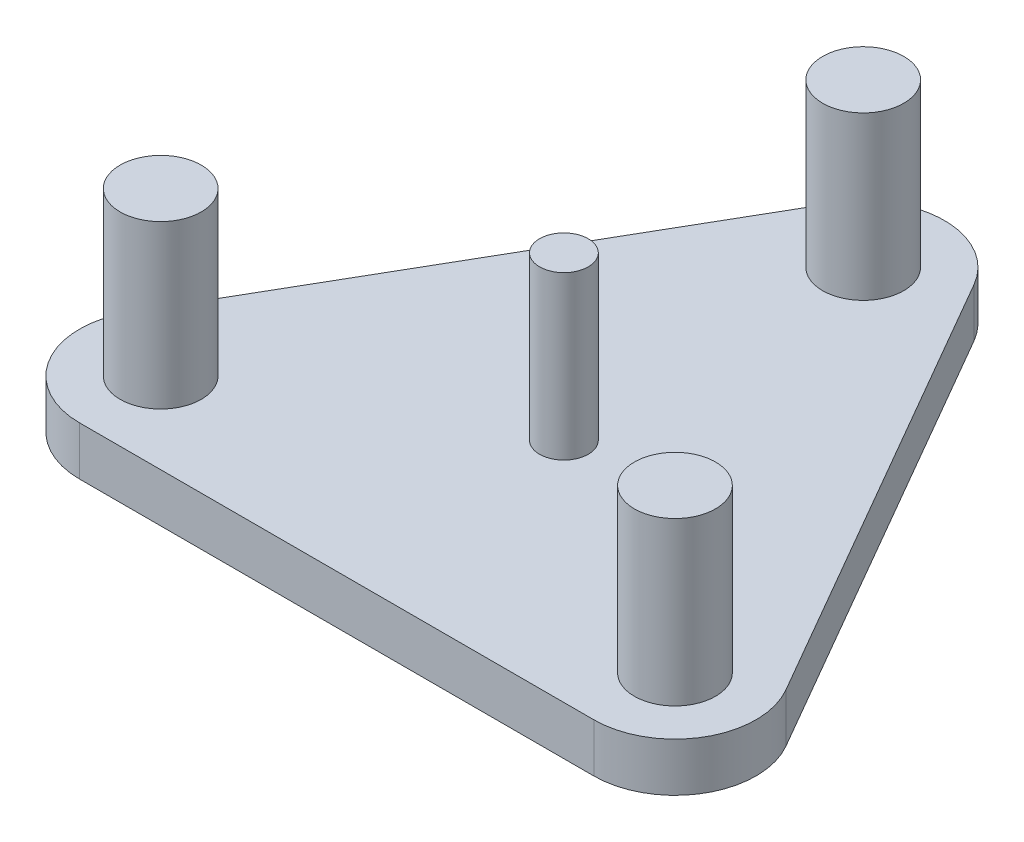
ISO-10303-21;
HEADER;
FILE_DESCRIPTION(('STEP AP214'),'2;1');
FILE_NAME('part.step','',(''),(''),'','','');
FILE_SCHEMA(('AUTOMOTIVE_DESIGN { 1 0 10303 214 1 1 1 1 }'));
ENDSEC;
DATA;
#1=APPLICATION_CONTEXT('core data for automotive mechanical design processes');
#2=APPLICATION_PROTOCOL_DEFINITION('international standard','automotive_design',2000,#1);
#3=PRODUCT_CONTEXT('',#1,'mechanical');
#4=PRODUCT('Part','Part','',(#3));
#5=PRODUCT_RELATED_PRODUCT_CATEGORY('part','',(#4));
#6=PRODUCT_DEFINITION_FORMATION('','',#4);
#7=PRODUCT_DEFINITION_CONTEXT('part definition',#1,'design');
#8=PRODUCT_DEFINITION('design','',#6,#7);
#9=PRODUCT_DEFINITION_SHAPE('','',#8);
#10=(LENGTH_UNIT() NAMED_UNIT(*) SI_UNIT(.MILLI.,.METRE.));
#11=(NAMED_UNIT(*) PLANE_ANGLE_UNIT() SI_UNIT($,.RADIAN.));
#12=(NAMED_UNIT(*) SI_UNIT($,.STERADIAN.) SOLID_ANGLE_UNIT());
#13=UNCERTAINTY_MEASURE_WITH_UNIT(LENGTH_MEASURE(1.E-05),#10,'distance_accuracy_value','');
#14=(GEOMETRIC_REPRESENTATION_CONTEXT(3) GLOBAL_UNCERTAINTY_ASSIGNED_CONTEXT((#13)) GLOBAL_UNIT_ASSIGNED_CONTEXT((#10,
#11,#12)) REPRESENTATION_CONTEXT('',''));
#15=CARTESIAN_POINT('',(0.,0.,0.));
#16=DIRECTION('',(0.,0.,1.));
#17=DIRECTION('',(1.,0.,0.));
#18=AXIS2_PLACEMENT_3D('',#15,#16,#17);
#19=CARTESIAN_POINT('',(15.8397459621556,3.,-5.));
#20=DIRECTION('',(0.,-1.,0.));
#21=DIRECTION('',(0.,0.,-1.));
#22=AXIS2_PLACEMENT_3D('',#19,#20,#21);
#23=CYLINDRICAL_SURFACE('',#22,5.);
#24=CARTESIAN_POINT('',(15.8397459621556,0.,-5.));
#25=DIRECTION('',(0.,1.,0.));
#26=DIRECTION('',(0.,0.,1.));
#27=AXIS2_PLACEMENT_3D('',#24,#25,#26);
#28=CIRCLE('',#27,5.);
#29=CARTESIAN_POINT('',(15.8397459621556,0.,0.));
#30=VERTEX_POINT('',#29);
#31=CARTESIAN_POINT('',(20.1698729810778,0.,-7.5));
#32=VERTEX_POINT('',#31);
#33=EDGE_CURVE('E117',#30,#32,#28,.T.);
#34=ORIENTED_EDGE('',*,*,#33,.T.);
#35=DIRECTION('',(0.,-1.,0.));
#36=VECTOR('',#35,1.);
#37=CARTESIAN_POINT('',(20.1698729810778,3.,-7.5));
#38=LINE('',#37,#36);
#39=CARTESIAN_POINT('',(20.1698729810778,3.,-7.5));
#40=VERTEX_POINT('',#39);
#41=EDGE_CURVE('E11',#40,#32,#38,.T.);
#42=ORIENTED_EDGE('',*,*,#41,.F.);
#43=CARTESIAN_POINT('',(15.8397459621556,3.,-5.));
#44=DIRECTION('',(0.,1.,0.));
#45=DIRECTION('',(0.,0.,1.));
#46=AXIS2_PLACEMENT_3D('',#43,#44,#45);
#47=CIRCLE('',#46,5.);
#48=CARTESIAN_POINT('',(15.8397459621556,3.,0.));
#49=VERTEX_POINT('',#48);
#50=EDGE_CURVE('E128',#49,#40,#47,.T.);
#51=ORIENTED_EDGE('',*,*,#50,.F.);
#52=DIRECTION('',(0.,-1.,0.));
#53=VECTOR('',#52,1.);
#54=CARTESIAN_POINT('',(15.8397459621556,3.,0.));
#55=LINE('',#54,#53);
#56=EDGE_CURVE('E113',#49,#30,#55,.T.);
#57=ORIENTED_EDGE('',*,*,#56,.T.);
#58=EDGE_LOOP('',(#34,#42,#51,#57));
#59=FACE_BOUND('',#58,.T.);
#60=ADVANCED_FACE('F33',(#59),#23,.T.);
#61=CARTESIAN_POINT('',(20.1698729810778,3.,-7.5));
#62=DIRECTION('',(-0.866025403784439,0.,0.5));
#63=DIRECTION('',(0.5,0.,0.866025403784439));
#64=AXIS2_PLACEMENT_3D('',#61,#62,#63);
#65=PLANE('',#64);
#66=DIRECTION('',(-0.5,0.,-0.866025403784439));
#67=VECTOR('',#66,1.);
#68=CARTESIAN_POINT('',(20.1698729810778,0.,-7.5));
#69=LINE('',#68,#67);
#70=CARTESIAN_POINT('',(4.3301270189222,0.,-34.9352447854375));
#71=VERTEX_POINT('',#70);
#72=EDGE_CURVE('E120',#32,#71,#69,.T.);
#73=ORIENTED_EDGE('',*,*,#72,.T.);
#74=DIRECTION('',(0.,-1.,0.));
#75=VECTOR('',#74,1.);
#76=CARTESIAN_POINT('',(4.3301270189222,3.,-34.9352447854375));
#77=LINE('',#76,#75);
#78=CARTESIAN_POINT('',(4.3301270189222,3.,-34.9352447854375));
#79=VERTEX_POINT('',#78);
#80=EDGE_CURVE('E41',#79,#71,#77,.T.);
#81=ORIENTED_EDGE('',*,*,#80,.F.);
#82=DIRECTION('',(-0.5,0.,-0.866025403784439));
#83=VECTOR('',#82,1.);
#84=CARTESIAN_POINT('',(20.1698729810778,3.,-7.5));
#85=LINE('',#84,#83);
#86=EDGE_CURVE('E86',#40,#79,#85,.T.);
#87=ORIENTED_EDGE('',*,*,#86,.F.);
#88=ORIENTED_EDGE('',*,*,#41,.T.);
#89=EDGE_LOOP('',(#73,#81,#87,#88));
#90=FACE_BOUND('',#89,.T.);
#91=ADVANCED_FACE('F153',(#90),#65,.F.);
#92=CARTESIAN_POINT('',(0.,3.,-32.4352447854375));
#93=DIRECTION('',(0.,-1.,0.));
#94=DIRECTION('',(0.,0.,-1.));
#95=AXIS2_PLACEMENT_3D('',#92,#93,#94);
#96=CYLINDRICAL_SURFACE('',#95,5.);
#97=CARTESIAN_POINT('',(0.,0.,-32.4352447854375));
#98=DIRECTION('',(0.,1.,0.));
#99=DIRECTION('',(0.,0.,1.));
#100=AXIS2_PLACEMENT_3D('',#97,#98,#99);
#101=CIRCLE('',#100,5.);
#102=CARTESIAN_POINT('',(-4.3301270189222,0.,-34.9352447854375));
#103=VERTEX_POINT('',#102);
#104=EDGE_CURVE('E123',#71,#103,#101,.T.);
#105=ORIENTED_EDGE('',*,*,#104,.T.);
#106=DIRECTION('',(0.,-1.,0.));
#107=VECTOR('',#106,1.);
#108=CARTESIAN_POINT('',(-4.3301270189222,3.,-34.9352447854375));
#109=LINE('',#108,#107);
#110=CARTESIAN_POINT('',(-4.3301270189222,3.,-34.9352447854375));
#111=VERTEX_POINT('',#110);
#112=EDGE_CURVE('E108',#111,#103,#109,.T.);
#113=ORIENTED_EDGE('',*,*,#112,.F.);
#114=CARTESIAN_POINT('',(0.,3.,-32.4352447854375));
#115=DIRECTION('',(0.,1.,0.));
#116=DIRECTION('',(0.,0.,1.));
#117=AXIS2_PLACEMENT_3D('',#114,#115,#116);
#118=CIRCLE('',#117,5.);
#119=EDGE_CURVE('E99',#79,#111,#118,.T.);
#120=ORIENTED_EDGE('',*,*,#119,.F.);
#121=ORIENTED_EDGE('',*,*,#80,.T.);
#122=EDGE_LOOP('',(#105,#113,#120,#121));
#123=FACE_BOUND('',#122,.T.);
#124=ADVANCED_FACE('F134',(#123),#96,.T.);
#125=CARTESIAN_POINT('',(-4.3301270189222,3.,-34.9352447854375));
#126=DIRECTION('',(0.866025403784439,0.,0.5));
#127=DIRECTION('',(0.5,0.,-0.866025403784439));
#128=AXIS2_PLACEMENT_3D('',#125,#126,#127);
#129=PLANE('',#128);
#130=DIRECTION('',(-0.5,0.,0.866025403784439));
#131=VECTOR('',#130,1.);
#132=CARTESIAN_POINT('',(-4.3301270189222,0.,-34.9352447854375));
#133=LINE('',#132,#131);
#134=CARTESIAN_POINT('',(-20.1698729810778,0.,-7.5));
#135=VERTEX_POINT('',#134);
#136=EDGE_CURVE('E107',#103,#135,#133,.T.);
#137=ORIENTED_EDGE('',*,*,#136,.T.);
#138=DIRECTION('',(0.,-1.,0.));
#139=VECTOR('',#138,1.);
#140=CARTESIAN_POINT('',(-20.1698729810778,3.,-7.5));
#141=LINE('',#140,#139);
#142=CARTESIAN_POINT('',(-20.1698729810778,3.,-7.5));
#143=VERTEX_POINT('',#142);
#144=EDGE_CURVE('E104',#143,#135,#141,.T.);
#145=ORIENTED_EDGE('',*,*,#144,.F.);
#146=DIRECTION('',(-0.5,0.,0.866025403784439));
#147=VECTOR('',#146,1.);
#148=CARTESIAN_POINT('',(-4.3301270189222,3.,-34.9352447854375));
#149=LINE('',#148,#147);
#150=EDGE_CURVE('E93',#111,#143,#149,.T.);
#151=ORIENTED_EDGE('',*,*,#150,.F.);
#152=ORIENTED_EDGE('',*,*,#112,.T.);
#153=EDGE_LOOP('',(#137,#145,#151,#152));
#154=FACE_BOUND('',#153,.T.);
#155=ADVANCED_FACE('F105',(#154),#129,.F.);
#156=CARTESIAN_POINT('',(-15.8397459621556,3.,-5.));
#157=DIRECTION('',(0.,-1.,0.));
#158=DIRECTION('',(0.,0.,-1.));
#159=AXIS2_PLACEMENT_3D('',#156,#157,#158);
#160=CYLINDRICAL_SURFACE('',#159,5.);
#161=CARTESIAN_POINT('',(-15.8397459621556,0.,-5.));
#162=DIRECTION('',(0.,1.,0.));
#163=DIRECTION('',(0.,0.,-1.));
#164=AXIS2_PLACEMENT_3D('',#161,#162,#163);
#165=CIRCLE('',#164,5.);
#166=CARTESIAN_POINT('',(-15.8397459621556,0.,0.));
#167=VERTEX_POINT('',#166);
#168=EDGE_CURVE('E72',#135,#167,#165,.T.);
#169=ORIENTED_EDGE('',*,*,#168,.T.);
#170=DIRECTION('',(0.,-1.,0.));
#171=VECTOR('',#170,1.);
#172=CARTESIAN_POINT('',(-15.8397459621556,3.,0.));
#173=LINE('',#172,#171);
#174=CARTESIAN_POINT('',(-15.8397459621556,3.,0.));
#175=VERTEX_POINT('',#174);
#176=EDGE_CURVE('E109',#175,#167,#173,.T.);
#177=ORIENTED_EDGE('',*,*,#176,.F.);
#178=CARTESIAN_POINT('',(-15.8397459621556,3.,-5.));
#179=DIRECTION('',(0.,1.,0.));
#180=DIRECTION('',(0.,0.,-1.));
#181=AXIS2_PLACEMENT_3D('',#178,#179,#180);
#182=CIRCLE('',#181,5.);
#183=EDGE_CURVE('E97',#143,#175,#182,.T.);
#184=ORIENTED_EDGE('',*,*,#183,.F.);
#185=ORIENTED_EDGE('',*,*,#144,.T.);
#186=EDGE_LOOP('',(#169,#177,#184,#185));
#187=FACE_BOUND('',#186,.T.);
#188=ADVANCED_FACE('F111',(#187),#160,.T.);
#189=CARTESIAN_POINT('',(-15.8397459621556,3.,0.));
#190=DIRECTION('',(0.,0.,-1.));
#191=DIRECTION('',(-1.,0.,0.));
#192=AXIS2_PLACEMENT_3D('',#189,#190,#191);
#193=PLANE('',#192);
#194=DIRECTION('',(1.,0.,0.));
#195=VECTOR('',#194,1.);
#196=CARTESIAN_POINT('',(-15.8397459621556,0.,0.));
#197=LINE('',#196,#195);
#198=EDGE_CURVE('E78',#167,#30,#197,.T.);
#199=ORIENTED_EDGE('',*,*,#198,.T.);
#200=ORIENTED_EDGE('',*,*,#56,.F.);
#201=DIRECTION('',(1.,0.,0.));
#202=VECTOR('',#201,1.);
#203=CARTESIAN_POINT('',(-15.8397459621556,3.,0.));
#204=LINE('',#203,#202);
#205=EDGE_CURVE('E49',#175,#49,#204,.T.);
#206=ORIENTED_EDGE('',*,*,#205,.F.);
#207=ORIENTED_EDGE('',*,*,#176,.T.);
#208=EDGE_LOOP('',(#199,#200,#206,#207));
#209=FACE_BOUND('',#208,.T.);
#210=ADVANCED_FACE('F141',(#209),#193,.F.);
#211=CARTESIAN_POINT('',(15.8397459621556,3.,-5.));
#212=DIRECTION('',(0.,1.,0.));
#213=DIRECTION('',(0.,0.,1.));
#214=AXIS2_PLACEMENT_3D('',#211,#212,#213);
#215=PLANE('',#214);
#216=CARTESIAN_POINT('',(0.00810395870140534,3.,-13.9903694412361));
#217=DIRECTION('',(0.,1.,0.));
#218=DIRECTION('',(0.,0.,1.));
#219=AXIS2_PLACEMENT_3D('',#216,#217,#218);
#220=CIRCLE('',#219,1.5);
#221=CARTESIAN_POINT('',(0.00810395870140534,3.,-12.4903694412361));
#222=VERTEX_POINT('',#221);
#223=EDGE_CURVE('E276',#222,#222,#220,.T.);
#224=ORIENTED_EDGE('',*,*,#223,.F.);
#225=EDGE_LOOP('',(#224));
#226=FACE_BOUND('',#225,.T.);
#227=CARTESIAN_POINT('',(-15.8397459621556,3.,-5.));
#228=DIRECTION('',(0.,1.,0.));
#229=DIRECTION('',(0.,0.,1.));
#230=AXIS2_PLACEMENT_3D('',#227,#228,#229);
#231=CIRCLE('',#230,2.5);
#232=CARTESIAN_POINT('',(-15.8397459621556,3.,-2.5));
#233=VERTEX_POINT('',#232);
#234=EDGE_CURVE('E275',#233,#233,#231,.T.);
#235=ORIENTED_EDGE('',*,*,#234,.F.);
#236=EDGE_LOOP('',(#235));
#237=FACE_BOUND('',#236,.T.);
#238=CARTESIAN_POINT('',(15.8397459621556,3.,-5.));
#239=DIRECTION('',(0.,1.,0.));
#240=DIRECTION('',(0.,0.,1.));
#241=AXIS2_PLACEMENT_3D('',#238,#239,#240);
#242=CIRCLE('',#241,2.5);
#243=CARTESIAN_POINT('',(15.8397459621556,3.,-2.5));
#244=VERTEX_POINT('',#243);
#245=EDGE_CURVE('E285',#244,#244,#242,.T.);
#246=ORIENTED_EDGE('',*,*,#245,.F.);
#247=EDGE_LOOP('',(#246));
#248=FACE_BOUND('',#247,.T.);
#249=CARTESIAN_POINT('',(0.,3.,-32.4352447854375));
#250=DIRECTION('',(0.,1.,0.));
#251=DIRECTION('',(0.,0.,1.));
#252=AXIS2_PLACEMENT_3D('',#249,#250,#251);
#253=CIRCLE('',#252,2.5);
#254=CARTESIAN_POINT('',(0.,3.,-29.9352447854375));
#255=VERTEX_POINT('',#254);
#256=EDGE_CURVE('E290',#255,#255,#253,.T.);
#257=ORIENTED_EDGE('',*,*,#256,.F.);
#258=EDGE_LOOP('',(#257));
#259=FACE_BOUND('',#258,.T.);
#260=ORIENTED_EDGE('',*,*,#50,.T.);
#261=ORIENTED_EDGE('',*,*,#86,.T.);
#262=ORIENTED_EDGE('',*,*,#119,.T.);
#263=ORIENTED_EDGE('',*,*,#150,.T.);
#264=ORIENTED_EDGE('',*,*,#183,.T.);
#265=ORIENTED_EDGE('',*,*,#205,.T.);
#266=EDGE_LOOP('',(#260,#261,#262,#263,#264,#265));
#267=FACE_BOUND('',#266,.T.);
#268=ADVANCED_FACE('F95',(#226,#237,#248,#259,#267),#215,.T.);
#269=CARTESIAN_POINT('',(15.8397459621556,0.,-5.));
#270=DIRECTION('',(0.,1.,0.));
#271=DIRECTION('',(0.,0.,1.));
#272=AXIS2_PLACEMENT_3D('',#269,#270,#271);
#273=PLANE('',#272);
#274=ORIENTED_EDGE('',*,*,#33,.F.);
#275=ORIENTED_EDGE('',*,*,#198,.F.);
#276=ORIENTED_EDGE('',*,*,#168,.F.);
#277=ORIENTED_EDGE('',*,*,#136,.F.);
#278=ORIENTED_EDGE('',*,*,#104,.F.);
#279=ORIENTED_EDGE('',*,*,#72,.F.);
#280=EDGE_LOOP('',(#274,#275,#276,#277,#278,#279));
#281=FACE_BOUND('',#280,.T.);
#282=ADVANCED_FACE('F137',(#281),#273,.F.);
#283=CARTESIAN_POINT('',(0.,13.,-32.4352447854375));
#284=DIRECTION('',(0.,-1.,0.));
#285=DIRECTION('',(0.,0.,-1.));
#286=AXIS2_PLACEMENT_3D('',#283,#284,#285);
#287=CYLINDRICAL_SURFACE('',#286,2.5);
#288=CARTESIAN_POINT('',(0.,13.,-32.4352447854375));
#289=DIRECTION('',(0.,1.,0.));
#290=DIRECTION('',(0.,0.,1.));
#291=AXIS2_PLACEMENT_3D('',#288,#289,#290);
#292=CIRCLE('',#291,2.5);
#293=CARTESIAN_POINT('',(0.,13.,-29.9352447854375));
#294=VERTEX_POINT('',#293);
#295=EDGE_CURVE('E121',#294,#294,#292,.T.);
#296=ORIENTED_EDGE('',*,*,#295,.F.);
#297=EDGE_LOOP('',(#296));
#298=FACE_BOUND('',#297,.T.);
#299=ORIENTED_EDGE('',*,*,#256,.T.);
#300=EDGE_LOOP('',(#299));
#301=FACE_BOUND('',#300,.T.);
#302=ADVANCED_FACE('F185',(#298,#301),#287,.T.);
#303=CARTESIAN_POINT('',(0.,13.,-32.4352447854375));
#304=DIRECTION('',(0.,1.,0.));
#305=DIRECTION('',(0.,0.,1.));
#306=AXIS2_PLACEMENT_3D('',#303,#304,#305);
#307=PLANE('',#306);
#308=ORIENTED_EDGE('',*,*,#295,.T.);
#309=EDGE_LOOP('',(#308));
#310=FACE_BOUND('',#309,.T.);
#311=ADVANCED_FACE('F193',(#310),#307,.T.);
#312=CARTESIAN_POINT('',(15.8397459621556,13.,-5.));
#313=DIRECTION('',(0.,-1.,0.));
#314=DIRECTION('',(0.,0.,-1.));
#315=AXIS2_PLACEMENT_3D('',#312,#313,#314);
#316=CYLINDRICAL_SURFACE('',#315,2.5);
#317=CARTESIAN_POINT('',(15.8397459621556,13.,-5.));
#318=DIRECTION('',(0.,1.,0.));
#319=DIRECTION('',(0.,0.,1.));
#320=AXIS2_PLACEMENT_3D('',#317,#318,#319);
#321=CIRCLE('',#320,2.5);
#322=CARTESIAN_POINT('',(15.8397459621556,13.,-2.5));
#323=VERTEX_POINT('',#322);
#324=EDGE_CURVE('E287',#323,#323,#321,.T.);
#325=ORIENTED_EDGE('',*,*,#324,.F.);
#326=EDGE_LOOP('',(#325));
#327=FACE_BOUND('',#326,.T.);
#328=ORIENTED_EDGE('',*,*,#245,.T.);
#329=EDGE_LOOP('',(#328));
#330=FACE_BOUND('',#329,.T.);
#331=ADVANCED_FACE('F203',(#327,#330),#316,.T.);
#332=CARTESIAN_POINT('',(15.8397459621556,13.,-5.));
#333=DIRECTION('',(0.,1.,0.));
#334=DIRECTION('',(0.,0.,1.));
#335=AXIS2_PLACEMENT_3D('',#332,#333,#334);
#336=PLANE('',#335);
#337=ORIENTED_EDGE('',*,*,#324,.T.);
#338=EDGE_LOOP('',(#337));
#339=FACE_BOUND('',#338,.T.);
#340=ADVANCED_FACE('F213',(#339),#336,.T.);
#341=CARTESIAN_POINT('',(-15.8397459621556,13.,-5.));
#342=DIRECTION('',(0.,-1.,0.));
#343=DIRECTION('',(0.,0.,-1.));
#344=AXIS2_PLACEMENT_3D('',#341,#342,#343);
#345=CYLINDRICAL_SURFACE('',#344,2.5);
#346=CARTESIAN_POINT('',(-15.8397459621556,13.,-5.));
#347=DIRECTION('',(0.,1.,0.));
#348=DIRECTION('',(0.,0.,1.));
#349=AXIS2_PLACEMENT_3D('',#346,#347,#348);
#350=CIRCLE('',#349,2.5);
#351=CARTESIAN_POINT('',(-15.8397459621556,13.,-2.5));
#352=VERTEX_POINT('',#351);
#353=EDGE_CURVE('E279',#352,#352,#350,.T.);
#354=ORIENTED_EDGE('',*,*,#353,.F.);
#355=EDGE_LOOP('',(#354));
#356=FACE_BOUND('',#355,.T.);
#357=ORIENTED_EDGE('',*,*,#234,.T.);
#358=EDGE_LOOP('',(#357));
#359=FACE_BOUND('',#358,.T.);
#360=ADVANCED_FACE('F223',(#356,#359),#345,.T.);
#361=CARTESIAN_POINT('',(-15.8397459621556,13.,-5.));
#362=DIRECTION('',(0.,1.,0.));
#363=DIRECTION('',(0.,0.,1.));
#364=AXIS2_PLACEMENT_3D('',#361,#362,#363);
#365=PLANE('',#364);
#366=ORIENTED_EDGE('',*,*,#353,.T.);
#367=EDGE_LOOP('',(#366));
#368=FACE_BOUND('',#367,.T.);
#369=ADVANCED_FACE('F233',(#368),#365,.T.);
#370=CARTESIAN_POINT('',(0.00810395870140534,13.,-13.9903694412361));
#371=DIRECTION('',(0.,-1.,0.));
#372=DIRECTION('',(0.,0.,-1.));
#373=AXIS2_PLACEMENT_3D('',#370,#371,#372);
#374=CYLINDRICAL_SURFACE('',#373,1.5);
#375=CARTESIAN_POINT('',(0.00810395870140534,13.,-13.9903694412361));
#376=DIRECTION('',(0.,1.,0.));
#377=DIRECTION('',(0.,0.,1.));
#378=AXIS2_PLACEMENT_3D('',#375,#376,#377);
#379=CIRCLE('',#378,1.5);
#380=CARTESIAN_POINT('',(0.00810395870140534,13.,-12.4903694412361));
#381=VERTEX_POINT('',#380);
#382=EDGE_CURVE('E274',#381,#381,#379,.T.);
#383=ORIENTED_EDGE('',*,*,#382,.F.);
#384=EDGE_LOOP('',(#383));
#385=FACE_BOUND('',#384,.T.);
#386=ORIENTED_EDGE('',*,*,#223,.T.);
#387=EDGE_LOOP('',(#386));
#388=FACE_BOUND('',#387,.T.);
#389=ADVANCED_FACE('F243',(#385,#388),#374,.T.);
#390=CARTESIAN_POINT('',(0.00810395870140534,13.,-13.9903694412361));
#391=DIRECTION('',(0.,1.,0.));
#392=DIRECTION('',(0.,0.,1.));
#393=AXIS2_PLACEMENT_3D('',#390,#391,#392);
#394=PLANE('',#393);
#395=ORIENTED_EDGE('',*,*,#382,.T.);
#396=EDGE_LOOP('',(#395));
#397=FACE_BOUND('',#396,.T.);
#398=ADVANCED_FACE('F258',(#397),#394,.T.);
#399=CLOSED_SHELL('',(#60,#91,#124,#155,#188,#210,#268,#282,#302,#311,#331,#340,#360,#369,#389,#398));
#400=MANIFOLD_SOLID_BREP('B2',#399);
#401=ADVANCED_BREP_SHAPE_REPRESENTATION('',(#18,#400),#14);
#402=SHAPE_DEFINITION_REPRESENTATION(#9,#401);
ENDSEC;
END-ISO-10303-21;
